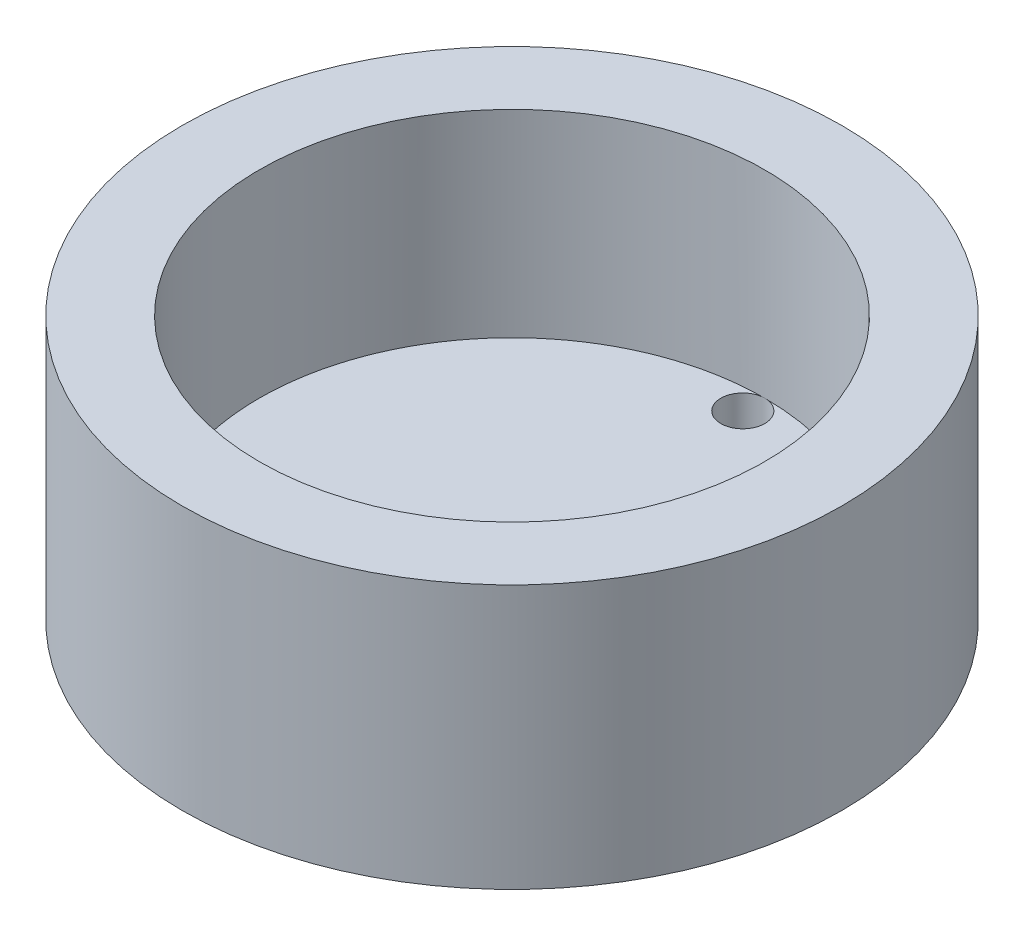
ISO-10303-21;
HEADER;
FILE_DESCRIPTION(('STEP AP214'),'2;1');
FILE_NAME('part.step','',(''),(''),'','','');
FILE_SCHEMA(('AUTOMOTIVE_DESIGN { 1 0 10303 214 1 1 1 1 }'));
ENDSEC;
DATA;
#1=APPLICATION_CONTEXT('core data for automotive mechanical design processes');
#2=APPLICATION_PROTOCOL_DEFINITION('international standard','automotive_design',2000,#1);
#3=PRODUCT_CONTEXT('',#1,'mechanical');
#4=PRODUCT('Part','Part','',(#3));
#5=PRODUCT_RELATED_PRODUCT_CATEGORY('part','',(#4));
#6=PRODUCT_DEFINITION_FORMATION('','',#4);
#7=PRODUCT_DEFINITION_CONTEXT('part definition',#1,'design');
#8=PRODUCT_DEFINITION('design','',#6,#7);
#9=PRODUCT_DEFINITION_SHAPE('','',#8);
#10=(LENGTH_UNIT() NAMED_UNIT(*) SI_UNIT(.MILLI.,.METRE.));
#11=(NAMED_UNIT(*) PLANE_ANGLE_UNIT() SI_UNIT($,.RADIAN.));
#12=(NAMED_UNIT(*) SI_UNIT($,.STERADIAN.) SOLID_ANGLE_UNIT());
#13=UNCERTAINTY_MEASURE_WITH_UNIT(LENGTH_MEASURE(1.E-05),#10,'distance_accuracy_value','');
#14=(GEOMETRIC_REPRESENTATION_CONTEXT(3) GLOBAL_UNCERTAINTY_ASSIGNED_CONTEXT((#13)) GLOBAL_UNIT_ASSIGNED_CONTEXT((#10,
#11,#12)) REPRESENTATION_CONTEXT('',''));
#15=CARTESIAN_POINT('',(0.,0.,0.));
#16=DIRECTION('',(0.,0.,1.));
#17=DIRECTION('',(1.,0.,0.));
#18=AXIS2_PLACEMENT_3D('',#15,#16,#17);
#19=CARTESIAN_POINT('',(0.,24.,0.));
#20=DIRECTION('',(0.,1.,0.));
#21=DIRECTION('',(0.,0.,1.));
#22=AXIS2_PLACEMENT_3D('',#19,#20,#21);
#23=PLANE('',#22);
#24=CARTESIAN_POINT('',(0.,24.,0.));
#25=DIRECTION('',(0.,1.,0.));
#26=DIRECTION('',(0.,0.,1.));
#27=AXIS2_PLACEMENT_3D('',#24,#25,#26);
#28=CIRCLE('',#27,30.);
#29=CARTESIAN_POINT('',(0.,24.,30.));
#30=VERTEX_POINT('',#29);
#31=EDGE_CURVE('E73',#30,#30,#28,.T.);
#32=ORIENTED_EDGE('',*,*,#31,.T.);
#33=EDGE_LOOP('',(#32));
#34=FACE_BOUND('',#33,.T.);
#35=CARTESIAN_POINT('',(0.,24.,0.));
#36=DIRECTION('',(0.,1.,0.));
#37=DIRECTION('',(0.,0.,1.));
#38=AXIS2_PLACEMENT_3D('',#35,#36,#37);
#39=CIRCLE('',#38,23.);
#40=CARTESIAN_POINT('',(0.,24.,23.));
#41=VERTEX_POINT('',#40);
#42=EDGE_CURVE('E62',#41,#41,#39,.T.);
#43=ORIENTED_EDGE('',*,*,#42,.F.);
#44=EDGE_LOOP('',(#43));
#45=FACE_BOUND('',#44,.T.);
#46=ADVANCED_FACE('F39',(#34,#45),#23,.T.);
#47=CARTESIAN_POINT('',(0.,0.,0.));
#48=DIRECTION('',(0.,1.,0.));
#49=DIRECTION('',(0.,0.,1.));
#50=AXIS2_PLACEMENT_3D('',#47,#48,#49);
#51=PLANE('',#50);
#52=CARTESIAN_POINT('',(0.,0.,21.));
#53=DIRECTION('',(0.,-1.,0.));
#54=DIRECTION('',(0.,0.,-1.));
#55=AXIS2_PLACEMENT_3D('',#52,#53,#54);
#56=CIRCLE('',#55,2.);
#57=CARTESIAN_POINT('',(0.,0.,19.));
#58=VERTEX_POINT('',#57);
#59=EDGE_CURVE('E66',#58,#58,#56,.T.);
#60=ORIENTED_EDGE('',*,*,#59,.F.);
#61=EDGE_LOOP('',(#60));
#62=FACE_BOUND('',#61,.T.);
#63=CARTESIAN_POINT('',(0.,0.,-21.));
#64=DIRECTION('',(0.,-1.,0.));
#65=DIRECTION('',(0.,0.,1.));
#66=AXIS2_PLACEMENT_3D('',#63,#64,#65);
#67=CIRCLE('',#66,2.);
#68=CARTESIAN_POINT('',(0.,0.,-19.));
#69=VERTEX_POINT('',#68);
#70=EDGE_CURVE('E68',#69,#69,#67,.T.);
#71=ORIENTED_EDGE('',*,*,#70,.F.);
#72=EDGE_LOOP('',(#71));
#73=FACE_BOUND('',#72,.T.);
#74=CARTESIAN_POINT('',(0.,0.,0.));
#75=DIRECTION('',(0.,1.,0.));
#76=DIRECTION('',(0.,0.,1.));
#77=AXIS2_PLACEMENT_3D('',#74,#75,#76);
#78=CIRCLE('',#77,30.);
#79=CARTESIAN_POINT('',(0.,0.,30.));
#80=VERTEX_POINT('',#79);
#81=EDGE_CURVE('E64',#80,#80,#78,.T.);
#82=ORIENTED_EDGE('',*,*,#81,.F.);
#83=EDGE_LOOP('',(#82));
#84=FACE_BOUND('',#83,.T.);
#85=ADVANCED_FACE('F81',(#62,#73,#84),#51,.F.);
#86=CARTESIAN_POINT('',(0.,24.,0.));
#87=DIRECTION('',(0.,-1.,0.));
#88=DIRECTION('',(0.,0.,-1.));
#89=AXIS2_PLACEMENT_3D('',#86,#87,#88);
#90=CYLINDRICAL_SURFACE('',#89,30.);
#91=ORIENTED_EDGE('',*,*,#31,.F.);
#92=EDGE_LOOP('',(#91));
#93=FACE_BOUND('',#92,.T.);
#94=ORIENTED_EDGE('',*,*,#81,.T.);
#95=EDGE_LOOP('',(#94));
#96=FACE_BOUND('',#95,.T.);
#97=ADVANCED_FACE('F41',(#93,#96),#90,.T.);
#98=CARTESIAN_POINT('',(0.,24.,0.));
#99=DIRECTION('',(0.,-1.,0.));
#100=DIRECTION('',(0.,0.,-1.));
#101=AXIS2_PLACEMENT_3D('',#98,#99,#100);
#102=CYLINDRICAL_SURFACE('',#101,23.);
#103=CARTESIAN_POINT('',(0.,6.,0.));
#104=DIRECTION('',(0.,1.,0.));
#105=DIRECTION('',(0.,0.,1.));
#106=AXIS2_PLACEMENT_3D('',#103,#104,#105);
#107=CIRCLE('',#106,23.);
#108=CARTESIAN_POINT('',(0.,6.,23.));
#109=VERTEX_POINT('',#108);
#110=CARTESIAN_POINT('',(0.,6.,-23.));
#111=VERTEX_POINT('',#110);
#112=EDGE_CURVE('E11',#109,#111,#107,.T.);
#113=ORIENTED_EDGE('',*,*,#112,.F.);
#114=EDGE_CURVE('E48',#111,#109,#107,.T.);
#115=ORIENTED_EDGE('',*,*,#114,.F.);
#116=EDGE_LOOP('',(#113,#115));
#117=FACE_BOUND('',#116,.T.);
#118=ORIENTED_EDGE('',*,*,#42,.T.);
#119=EDGE_LOOP('',(#118));
#120=FACE_BOUND('',#119,.T.);
#121=ADVANCED_FACE('F88',(#117,#120),#102,.F.);
#122=CARTESIAN_POINT('',(0.,6.,0.));
#123=DIRECTION('',(0.,1.,0.));
#124=DIRECTION('',(0.,0.,1.));
#125=AXIS2_PLACEMENT_3D('',#122,#123,#124);
#126=PLANE('',#125);
#127=ORIENTED_EDGE('',*,*,#114,.T.);
#128=CARTESIAN_POINT('',(0.,6.,21.));
#129=DIRECTION('',(0.,1.,0.));
#130=DIRECTION('',(0.,0.,1.));
#131=AXIS2_PLACEMENT_3D('',#128,#129,#130);
#132=CIRCLE('',#131,2.);
#133=EDGE_CURVE('E43',#109,#109,#132,.T.);
#134=ORIENTED_EDGE('',*,*,#133,.F.);
#135=ORIENTED_EDGE('',*,*,#112,.T.);
#136=CARTESIAN_POINT('',(0.,6.,-21.));
#137=DIRECTION('',(0.,1.,0.));
#138=DIRECTION('',(0.,0.,1.));
#139=AXIS2_PLACEMENT_3D('',#136,#137,#138);
#140=CIRCLE('',#139,2.);
#141=EDGE_CURVE('E54',#111,#111,#140,.T.);
#142=ORIENTED_EDGE('',*,*,#141,.F.);
#143=EDGE_LOOP('',(#127,#134,#135,#142));
#144=FACE_BOUND('',#143,.T.);
#145=ADVANCED_FACE('F93',(#144),#126,.T.);
#146=CARTESIAN_POINT('',(0.,24.,-21.));
#147=DIRECTION('',(0.,-1.,0.));
#148=DIRECTION('',(0.,0.,-1.));
#149=AXIS2_PLACEMENT_3D('',#146,#147,#148);
#150=CYLINDRICAL_SURFACE('',#149,2.);
#151=ORIENTED_EDGE('',*,*,#141,.T.);
#152=EDGE_LOOP('',(#151));
#153=FACE_BOUND('',#152,.T.);
#154=ORIENTED_EDGE('',*,*,#70,.T.);
#155=EDGE_LOOP('',(#154));
#156=FACE_BOUND('',#155,.T.);
#157=ADVANCED_FACE('F79',(#153,#156),#150,.F.);
#158=CARTESIAN_POINT('',(0.,24.,21.));
#159=DIRECTION('',(0.,-1.,0.));
#160=DIRECTION('',(0.,0.,-1.));
#161=AXIS2_PLACEMENT_3D('',#158,#159,#160);
#162=CYLINDRICAL_SURFACE('',#161,2.);
#163=ORIENTED_EDGE('',*,*,#133,.T.);
#164=EDGE_LOOP('',(#163));
#165=FACE_BOUND('',#164,.T.);
#166=ORIENTED_EDGE('',*,*,#59,.T.);
#167=EDGE_LOOP('',(#166));
#168=FACE_BOUND('',#167,.T.);
#169=ADVANCED_FACE('F58',(#165,#168),#162,.F.);
#170=CLOSED_SHELL('',(#46,#85,#97,#121,#145,#157,#169));
#171=MANIFOLD_SOLID_BREP('B2',#170);
#172=ADVANCED_BREP_SHAPE_REPRESENTATION('',(#18,#171),#14);
#173=SHAPE_DEFINITION_REPRESENTATION(#9,#172);
ENDSEC;
END-ISO-10303-21;
